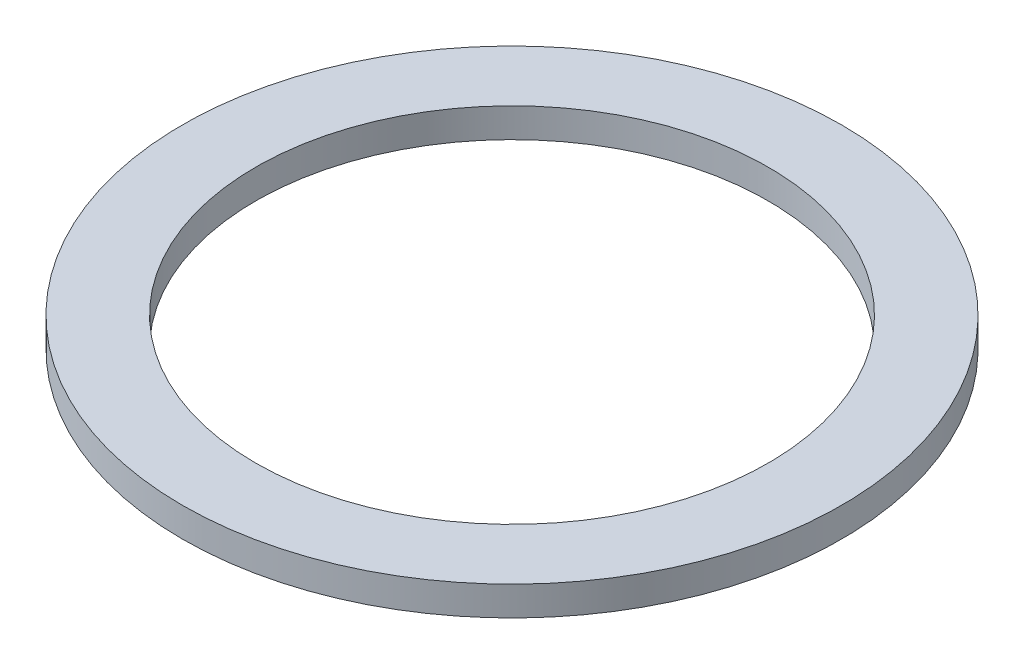
ISO-10303-21;
HEADER;
FILE_DESCRIPTION(('STEP AP214'),'2;1');
FILE_NAME('part.step','',(''),(''),'','','');
FILE_SCHEMA(('AUTOMOTIVE_DESIGN { 1 0 10303 214 1 1 1 1 }'));
ENDSEC;
DATA;
#1=APPLICATION_CONTEXT('core data for automotive mechanical design processes');
#2=APPLICATION_PROTOCOL_DEFINITION('international standard','automotive_design',2000,#1);
#3=PRODUCT_CONTEXT('',#1,'mechanical');
#4=PRODUCT('Part','Part','',(#3));
#5=PRODUCT_RELATED_PRODUCT_CATEGORY('part','',(#4));
#6=PRODUCT_DEFINITION_FORMATION('','',#4);
#7=PRODUCT_DEFINITION_CONTEXT('part definition',#1,'design');
#8=PRODUCT_DEFINITION('design','',#6,#7);
#9=PRODUCT_DEFINITION_SHAPE('','',#8);
#10=(LENGTH_UNIT() NAMED_UNIT(*) SI_UNIT(.MILLI.,.METRE.));
#11=(NAMED_UNIT(*) PLANE_ANGLE_UNIT() SI_UNIT($,.RADIAN.));
#12=(NAMED_UNIT(*) SI_UNIT($,.STERADIAN.) SOLID_ANGLE_UNIT());
#13=UNCERTAINTY_MEASURE_WITH_UNIT(LENGTH_MEASURE(1.E-05),#10,'distance_accuracy_value','');
#14=(GEOMETRIC_REPRESENTATION_CONTEXT(3) GLOBAL_UNCERTAINTY_ASSIGNED_CONTEXT((#13)) GLOBAL_UNIT_ASSIGNED_CONTEXT((#10,
#11,#12)) REPRESENTATION_CONTEXT('',''));
#15=CARTESIAN_POINT('',(0.,0.,0.));
#16=DIRECTION('',(0.,0.,1.));
#17=DIRECTION('',(1.,0.,0.));
#18=AXIS2_PLACEMENT_3D('',#15,#16,#17);
#19=CARTESIAN_POINT('',(0.,4.,0.));
#20=DIRECTION('',(0.,1.,0.));
#21=DIRECTION('',(0.,0.,1.));
#22=AXIS2_PLACEMENT_3D('',#19,#20,#21);
#23=PLANE('',#22);
#24=CARTESIAN_POINT('',(0.,4.,0.));
#25=DIRECTION('',(0.,1.,0.));
#26=DIRECTION('',(0.,0.,1.));
#27=AXIS2_PLACEMENT_3D('',#24,#25,#26);
#28=CIRCLE('',#27,45.);
#29=CARTESIAN_POINT('',(0.,4.,45.));
#30=VERTEX_POINT('',#29);
#31=EDGE_CURVE('E10',#30,#30,#28,.T.);
#32=ORIENTED_EDGE('',*,*,#31,.T.);
#33=EDGE_LOOP('',(#32));
#34=FACE_BOUND('',#33,.T.);
#35=CARTESIAN_POINT('',(0.,4.,0.));
#36=DIRECTION('',(0.,1.,0.));
#37=DIRECTION('',(0.,0.,1.));
#38=AXIS2_PLACEMENT_3D('',#35,#36,#37);
#39=CIRCLE('',#38,35.);
#40=CARTESIAN_POINT('',(0.,4.,35.));
#41=VERTEX_POINT('',#40);
#42=EDGE_CURVE('E41',#41,#41,#39,.T.);
#43=ORIENTED_EDGE('',*,*,#42,.F.);
#44=EDGE_LOOP('',(#43));
#45=FACE_BOUND('',#44,.T.);
#46=ADVANCED_FACE('F30',(#34,#45),#23,.T.);
#47=CARTESIAN_POINT('',(0.,0.,0.));
#48=DIRECTION('',(0.,1.,0.));
#49=DIRECTION('',(0.,0.,1.));
#50=AXIS2_PLACEMENT_3D('',#47,#48,#49);
#51=PLANE('',#50);
#52=CARTESIAN_POINT('',(0.,0.,0.));
#53=DIRECTION('',(0.,1.,0.));
#54=DIRECTION('',(0.,0.,1.));
#55=AXIS2_PLACEMENT_3D('',#52,#53,#54);
#56=CIRCLE('',#55,45.);
#57=CARTESIAN_POINT('',(0.,0.,45.));
#58=VERTEX_POINT('',#57);
#59=EDGE_CURVE('E34',#58,#58,#56,.T.);
#60=ORIENTED_EDGE('',*,*,#59,.F.);
#61=EDGE_LOOP('',(#60));
#62=FACE_BOUND('',#61,.T.);
#63=CARTESIAN_POINT('',(0.,0.,0.));
#64=DIRECTION('',(0.,1.,0.));
#65=DIRECTION('',(0.,0.,1.));
#66=AXIS2_PLACEMENT_3D('',#63,#64,#65);
#67=CIRCLE('',#66,35.);
#68=CARTESIAN_POINT('',(0.,0.,35.));
#69=VERTEX_POINT('',#68);
#70=EDGE_CURVE('E43',#69,#69,#67,.T.);
#71=ORIENTED_EDGE('',*,*,#70,.T.);
#72=EDGE_LOOP('',(#71));
#73=FACE_BOUND('',#72,.T.);
#74=ADVANCED_FACE('F53',(#62,#73),#51,.F.);
#75=CARTESIAN_POINT('',(0.,4.,0.));
#76=DIRECTION('',(0.,-1.,0.));
#77=DIRECTION('',(0.,0.,-1.));
#78=AXIS2_PLACEMENT_3D('',#75,#76,#77);
#79=CYLINDRICAL_SURFACE('',#78,45.);
#80=ORIENTED_EDGE('',*,*,#31,.F.);
#81=EDGE_LOOP('',(#80));
#82=FACE_BOUND('',#81,.T.);
#83=ORIENTED_EDGE('',*,*,#59,.T.);
#84=EDGE_LOOP('',(#83));
#85=FACE_BOUND('',#84,.T.);
#86=ADVANCED_FACE('F32',(#82,#85),#79,.T.);
#87=CARTESIAN_POINT('',(0.,4.,0.));
#88=DIRECTION('',(0.,-1.,0.));
#89=DIRECTION('',(0.,0.,-1.));
#90=AXIS2_PLACEMENT_3D('',#87,#88,#89);
#91=CYLINDRICAL_SURFACE('',#90,35.);
#92=ORIENTED_EDGE('',*,*,#42,.T.);
#93=EDGE_LOOP('',(#92));
#94=FACE_BOUND('',#93,.T.);
#95=ORIENTED_EDGE('',*,*,#70,.F.);
#96=EDGE_LOOP('',(#95));
#97=FACE_BOUND('',#96,.T.);
#98=ADVANCED_FACE('F49',(#94,#97),#91,.F.);
#99=CLOSED_SHELL('',(#46,#74,#86,#98));
#100=MANIFOLD_SOLID_BREP('B2',#99);
#101=ADVANCED_BREP_SHAPE_REPRESENTATION('',(#18,#100),#14);
#102=SHAPE_DEFINITION_REPRESENTATION(#9,#101);
ENDSEC;
END-ISO-10303-21;
